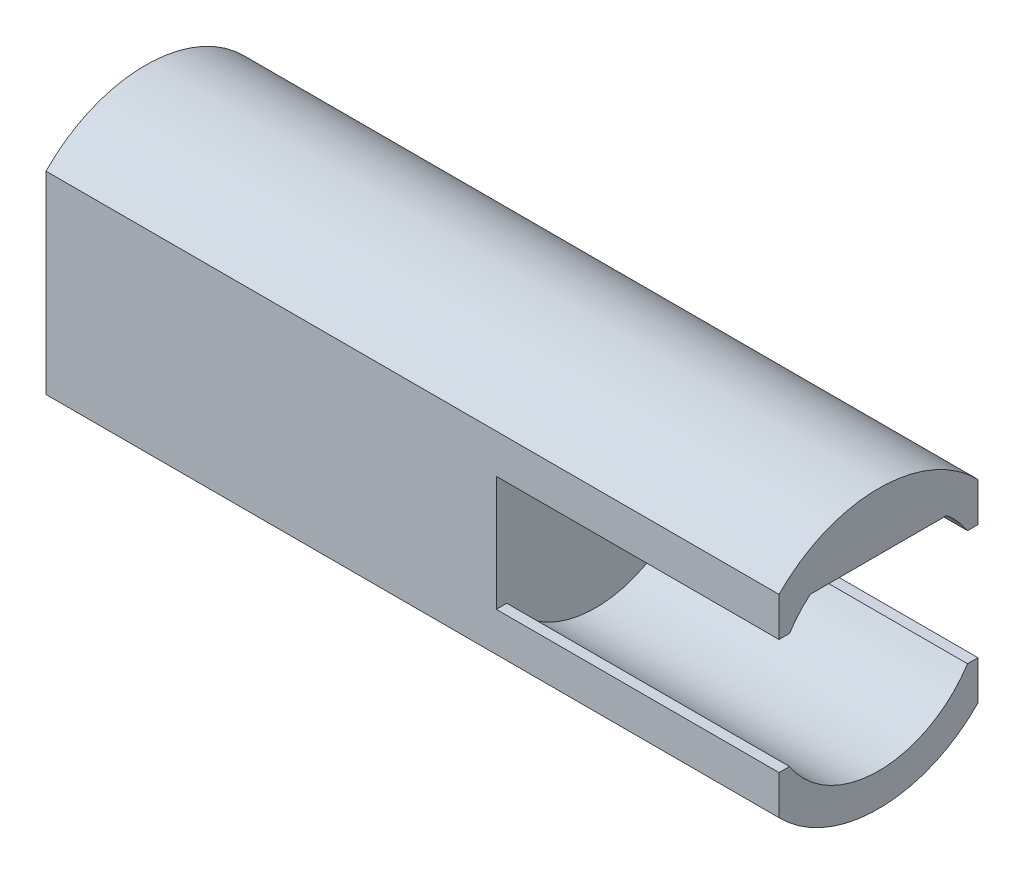
ISO-10303-21;
HEADER;
FILE_DESCRIPTION(('STEP AP214'),'2;1');
FILE_NAME('part.step','',(''),(''),'','','');
FILE_SCHEMA(('AUTOMOTIVE_DESIGN { 1 0 10303 214 1 1 1 1 }'));
ENDSEC;
DATA;
#1=APPLICATION_CONTEXT('core data for automotive mechanical design processes');
#2=APPLICATION_PROTOCOL_DEFINITION('international standard','automotive_design',2000,#1);
#3=PRODUCT_CONTEXT('',#1,'mechanical');
#4=PRODUCT('Part','Part','',(#3));
#5=PRODUCT_RELATED_PRODUCT_CATEGORY('part','',(#4));
#6=PRODUCT_DEFINITION_FORMATION('','',#4);
#7=PRODUCT_DEFINITION_CONTEXT('part definition',#1,'design');
#8=PRODUCT_DEFINITION('design','',#6,#7);
#9=PRODUCT_DEFINITION_SHAPE('','',#8);
#10=(LENGTH_UNIT() NAMED_UNIT(*) SI_UNIT(.MILLI.,.METRE.));
#11=(NAMED_UNIT(*) PLANE_ANGLE_UNIT() SI_UNIT($,.RADIAN.));
#12=(NAMED_UNIT(*) SI_UNIT($,.STERADIAN.) SOLID_ANGLE_UNIT());
#13=UNCERTAINTY_MEASURE_WITH_UNIT(LENGTH_MEASURE(1.E-05),#10,'distance_accuracy_value','');
#14=(GEOMETRIC_REPRESENTATION_CONTEXT(3) GLOBAL_UNCERTAINTY_ASSIGNED_CONTEXT((#13)) GLOBAL_UNIT_ASSIGNED_CONTEXT((#10,
#11,#12)) REPRESENTATION_CONTEXT('',''));
#15=CARTESIAN_POINT('',(0.,0.,0.));
#16=DIRECTION('',(0.,0.,1.));
#17=DIRECTION('',(1.,0.,0.));
#18=AXIS2_PLACEMENT_3D('',#15,#16,#17);
#19=CARTESIAN_POINT('',(0.,0.,0.));
#20=DIRECTION('',(-1.,0.,0.));
#21=DIRECTION('',(0.,0.,1.));
#22=AXIS2_PLACEMENT_3D('',#19,#20,#21);
#23=PLANE('',#22);
#24=DIRECTION('',(0.,0.,1.));
#25=VECTOR('',#24,1.);
#26=CARTESIAN_POINT('',(0.,-1.10028405423327,-1.7));
#27=LINE('',#26,#25);
#28=CARTESIAN_POINT('',(0.,-1.10028405423327,-1.9));
#29=VERTEX_POINT('',#28);
#30=CARTESIAN_POINT('',(0.,-1.10028405423328,-1.7));
#31=VERTEX_POINT('',#30);
#32=EDGE_CURVE('E168',#29,#31,#27,.T.);
#33=ORIENTED_EDGE('',*,*,#32,.F.);
#34=DIRECTION('',(0.,-1.,0.));
#35=VECTOR('',#34,1.);
#36=CARTESIAN_POINT('',(0.,1.84729532019112,-1.9));
#37=LINE('',#36,#35);
#38=CARTESIAN_POINT('',(0.,1.10028405423327,-1.9));
#39=VERTEX_POINT('',#38);
#40=EDGE_CURVE('E140',#39,#29,#37,.T.);
#41=ORIENTED_EDGE('',*,*,#40,.F.);
#42=DIRECTION('',(0.,0.,-1.));
#43=VECTOR('',#42,1.);
#44=CARTESIAN_POINT('',(0.,1.10028405423327,-1.7));
#45=LINE('',#44,#43);
#46=CARTESIAN_POINT('',(0.,1.10028405423327,-1.7));
#47=VERTEX_POINT('',#46);
#48=EDGE_CURVE('E197',#47,#39,#45,.T.);
#49=ORIENTED_EDGE('',*,*,#48,.F.);
#50=CARTESIAN_POINT('',(0.,0.,0.));
#51=DIRECTION('',(-1.,0.,0.));
#52=DIRECTION('',(0.,0.,-1.));
#53=AXIS2_PLACEMENT_3D('',#50,#51,#52);
#54=CIRCLE('',#53,2.025);
#55=CARTESIAN_POINT('',(0.,1.55,-1.30312125299221));
#56=VERTEX_POINT('',#55);
#57=EDGE_CURVE('E219',#56,#47,#54,.T.);
#58=ORIENTED_EDGE('',*,*,#57,.F.);
#59=DIRECTION('',(0.,0.,-1.));
#60=VECTOR('',#59,1.);
#61=CARTESIAN_POINT('',(0.,1.55,1.30312125299221));
#62=LINE('',#61,#60);
#63=CARTESIAN_POINT('',(0.,1.55,1.30312125299221));
#64=VERTEX_POINT('',#63);
#65=EDGE_CURVE('E216',#64,#56,#62,.T.);
#66=ORIENTED_EDGE('',*,*,#65,.F.);
#67=CARTESIAN_POINT('',(0.,0.,0.));
#68=DIRECTION('',(-1.,0.,0.));
#69=DIRECTION('',(0.,0.,-1.));
#70=AXIS2_PLACEMENT_3D('',#67,#68,#69);
#71=CIRCLE('',#70,2.025);
#72=CARTESIAN_POINT('',(0.,1.10028405423327,1.7));
#73=VERTEX_POINT('',#72);
#74=EDGE_CURVE('E213',#73,#64,#71,.T.);
#75=ORIENTED_EDGE('',*,*,#74,.F.);
#76=DIRECTION('',(0.,0.,-1.));
#77=VECTOR('',#76,1.);
#78=CARTESIAN_POINT('',(0.,1.10028405423327,1.9));
#79=LINE('',#78,#77);
#80=CARTESIAN_POINT('',(0.,1.10028405423327,1.9));
#81=VERTEX_POINT('',#80);
#82=EDGE_CURVE('E189',#81,#73,#79,.T.);
#83=ORIENTED_EDGE('',*,*,#82,.F.);
#84=DIRECTION('',(0.,1.,0.));
#85=VECTOR('',#84,1.);
#86=CARTESIAN_POINT('',(0.,-1.84729532019112,1.9));
#87=LINE('',#86,#85);
#88=CARTESIAN_POINT('',(0.,-1.10028405423327,1.9));
#89=VERTEX_POINT('',#88);
#90=EDGE_CURVE('E180',#89,#81,#87,.T.);
#91=ORIENTED_EDGE('',*,*,#90,.F.);
#92=DIRECTION('',(0.,0.,1.));
#93=VECTOR('',#92,1.);
#94=CARTESIAN_POINT('',(0.,-1.10028405423327,1.9));
#95=LINE('',#94,#93);
#96=CARTESIAN_POINT('',(0.,-1.10028405423327,1.7));
#97=VERTEX_POINT('',#96);
#98=EDGE_CURVE('E156',#97,#89,#95,.T.);
#99=ORIENTED_EDGE('',*,*,#98,.F.);
#100=CARTESIAN_POINT('',(0.,0.,0.));
#101=DIRECTION('',(-1.,0.,0.));
#102=DIRECTION('',(0.,0.,-1.));
#103=AXIS2_PLACEMENT_3D('',#100,#101,#102);
#104=CIRCLE('',#103,2.025);
#105=EDGE_CURVE('E158',#31,#97,#104,.T.);
#106=ORIENTED_EDGE('',*,*,#105,.F.);
#107=EDGE_LOOP('',(#33,#41,#49,#58,#66,#75,#83,#91,#99,#106));
#108=FACE_BOUND('',#107,.T.);
#109=ADVANCED_FACE('F33',(#108),#23,.F.);
#110=CARTESIAN_POINT('',(5.4,0.,0.));
#111=DIRECTION('',(-1.,0.,0.));
#112=DIRECTION('',(0.,0.,1.));
#113=AXIS2_PLACEMENT_3D('',#110,#111,#112);
#114=CYLINDRICAL_SURFACE('',#113,2.65);
#115=DIRECTION('',(-1.,0.,0.));
#116=VECTOR('',#115,1.);
#117=CARTESIAN_POINT('',(5.4,1.84729532019112,-1.9));
#118=LINE('',#117,#116);
#119=CARTESIAN_POINT('',(5.4,1.84729532019112,-1.9));
#120=VERTEX_POINT('',#119);
#121=CARTESIAN_POINT('',(-8.6,1.84729532019112,-1.9));
#122=VERTEX_POINT('',#121);
#123=EDGE_CURVE('E210',#120,#122,#118,.T.);
#124=ORIENTED_EDGE('',*,*,#123,.T.);
#125=CARTESIAN_POINT('',(-8.6,0.,0.));
#126=DIRECTION('',(1.,0.,0.));
#127=DIRECTION('',(0.,0.,-1.));
#128=AXIS2_PLACEMENT_3D('',#125,#126,#127);
#129=CIRCLE('',#128,2.65);
#130=CARTESIAN_POINT('',(-8.6,1.84729532019112,1.9));
#131=VERTEX_POINT('',#130);
#132=EDGE_CURVE('E181',#122,#131,#129,.T.);
#133=ORIENTED_EDGE('',*,*,#132,.T.);
#134=DIRECTION('',(-1.,0.,0.));
#135=VECTOR('',#134,1.);
#136=CARTESIAN_POINT('',(5.4,1.84729532019112,1.9));
#137=LINE('',#136,#135);
#138=CARTESIAN_POINT('',(5.4,1.84729532019112,1.9));
#139=VERTEX_POINT('',#138);
#140=EDGE_CURVE('E11',#139,#131,#137,.T.);
#141=ORIENTED_EDGE('',*,*,#140,.F.);
#142=CARTESIAN_POINT('',(5.4,0.,0.));
#143=DIRECTION('',(1.,0.,0.));
#144=DIRECTION('',(0.,0.,1.));
#145=AXIS2_PLACEMENT_3D('',#142,#143,#144);
#146=CIRCLE('',#145,2.65);
#147=EDGE_CURVE('E194',#120,#139,#146,.T.);
#148=ORIENTED_EDGE('',*,*,#147,.F.);
#149=EDGE_LOOP('',(#124,#133,#141,#148));
#150=FACE_BOUND('',#149,.T.);
#151=ADVANCED_FACE('F35',(#150),#114,.T.);
#152=CARTESIAN_POINT('',(5.4,1.84729532019112,1.9));
#153=DIRECTION('',(0.,0.,-1.));
#154=DIRECTION('',(-1.,0.,0.));
#155=AXIS2_PLACEMENT_3D('',#152,#153,#154);
#156=PLANE('',#155);
#157=ORIENTED_EDGE('',*,*,#140,.T.);
#158=DIRECTION('',(0.,-1.,0.));
#159=VECTOR('',#158,1.);
#160=CARTESIAN_POINT('',(-8.6,-1.84729532019112,1.9));
#161=LINE('',#160,#159);
#162=CARTESIAN_POINT('',(-8.6,-1.84729532019112,1.9));
#163=VERTEX_POINT('',#162);
#164=EDGE_CURVE('E184',#131,#163,#161,.T.);
#165=ORIENTED_EDGE('',*,*,#164,.T.);
#166=DIRECTION('',(1.,0.,0.));
#167=VECTOR('',#166,1.);
#168=CARTESIAN_POINT('',(-15.1215028942721,-1.84729532019112,1.9));
#169=LINE('',#168,#167);
#170=CARTESIAN_POINT('',(5.4,-1.84729532019112,1.9));
#171=VERTEX_POINT('',#170);
#172=EDGE_CURVE('E139',#163,#171,#169,.T.);
#173=ORIENTED_EDGE('',*,*,#172,.T.);
#174=DIRECTION('',(0.,-1.,0.));
#175=VECTOR('',#174,1.);
#176=CARTESIAN_POINT('',(5.4,-1.84729532019112,1.9));
#177=LINE('',#176,#175);
#178=CARTESIAN_POINT('',(5.4,-1.10028405423327,1.9));
#179=VERTEX_POINT('',#178);
#180=EDGE_CURVE('E155',#179,#171,#177,.T.);
#181=ORIENTED_EDGE('',*,*,#180,.F.);
#182=DIRECTION('',(-1.,0.,0.));
#183=VECTOR('',#182,1.);
#184=CARTESIAN_POINT('',(5.4,-1.10028405423327,1.9));
#185=LINE('',#184,#183);
#186=EDGE_CURVE('E167',#179,#89,#185,.T.);
#187=ORIENTED_EDGE('',*,*,#186,.T.);
#188=ORIENTED_EDGE('',*,*,#90,.T.);
#189=DIRECTION('',(-1.,0.,0.));
#190=VECTOR('',#189,1.);
#191=CARTESIAN_POINT('',(5.4,1.10028405423327,1.9));
#192=LINE('',#191,#190);
#193=CARTESIAN_POINT('',(5.4,1.10028405423327,1.9));
#194=VERTEX_POINT('',#193);
#195=EDGE_CURVE('E42',#194,#81,#192,.T.);
#196=ORIENTED_EDGE('',*,*,#195,.F.);
#197=DIRECTION('',(0.,-1.,0.));
#198=VECTOR('',#197,1.);
#199=CARTESIAN_POINT('',(5.4,1.84729532019112,1.9));
#200=LINE('',#199,#198);
#201=EDGE_CURVE('E196',#139,#194,#200,.T.);
#202=ORIENTED_EDGE('',*,*,#201,.F.);
#203=EDGE_LOOP('',(#157,#165,#173,#181,#187,#188,#196,#202));
#204=FACE_BOUND('',#203,.T.);
#205=ADVANCED_FACE('F246',(#204),#156,.F.);
#206=CARTESIAN_POINT('',(5.4,1.10028405423327,1.9));
#207=DIRECTION('',(0.,1.,0.));
#208=DIRECTION('',(0.,0.,1.));
#209=AXIS2_PLACEMENT_3D('',#206,#207,#208);
#210=PLANE('',#209);
#211=ORIENTED_EDGE('',*,*,#82,.T.);
#212=DIRECTION('',(-1.,0.,0.));
#213=VECTOR('',#212,1.);
#214=CARTESIAN_POINT('',(5.4,1.10028405423327,1.7));
#215=LINE('',#214,#213);
#216=CARTESIAN_POINT('',(5.4,1.10028405423327,1.7));
#217=VERTEX_POINT('',#216);
#218=EDGE_CURVE('E236',#217,#73,#215,.T.);
#219=ORIENTED_EDGE('',*,*,#218,.F.);
#220=DIRECTION('',(0.,0.,-1.));
#221=VECTOR('',#220,1.);
#222=CARTESIAN_POINT('',(5.4,1.10028405423327,1.9));
#223=LINE('',#222,#221);
#224=EDGE_CURVE('E199',#194,#217,#223,.T.);
#225=ORIENTED_EDGE('',*,*,#224,.F.);
#226=ORIENTED_EDGE('',*,*,#195,.T.);
#227=EDGE_LOOP('',(#211,#219,#225,#226));
#228=FACE_BOUND('',#227,.T.);
#229=ADVANCED_FACE('F242',(#228),#210,.F.);
#230=CARTESIAN_POINT('',(5.4,0.,0.));
#231=DIRECTION('',(-1.,0.,0.));
#232=DIRECTION('',(0.,0.,1.));
#233=AXIS2_PLACEMENT_3D('',#230,#231,#232);
#234=CYLINDRICAL_SURFACE('',#233,2.025);
#235=ORIENTED_EDGE('',*,*,#74,.T.);
#236=DIRECTION('',(-1.,0.,0.));
#237=VECTOR('',#236,1.);
#238=CARTESIAN_POINT('',(5.4,1.55,1.30312125299221));
#239=LINE('',#238,#237);
#240=CARTESIAN_POINT('',(5.4,1.55,1.30312125299221));
#241=VERTEX_POINT('',#240);
#242=EDGE_CURVE('E233',#241,#64,#239,.T.);
#243=ORIENTED_EDGE('',*,*,#242,.F.);
#244=CARTESIAN_POINT('',(5.4,0.,0.));
#245=DIRECTION('',(-1.,0.,0.));
#246=DIRECTION('',(0.,0.,-1.));
#247=AXIS2_PLACEMENT_3D('',#244,#245,#246);
#248=CIRCLE('',#247,2.025);
#249=EDGE_CURVE('E201',#217,#241,#248,.T.);
#250=ORIENTED_EDGE('',*,*,#249,.F.);
#251=ORIENTED_EDGE('',*,*,#218,.T.);
#252=EDGE_LOOP('',(#235,#243,#250,#251));
#253=FACE_BOUND('',#252,.T.);
#254=ADVANCED_FACE('F255',(#253),#234,.F.);
#255=CARTESIAN_POINT('',(5.4,1.55,1.30312125299221));
#256=DIRECTION('',(0.,1.,0.));
#257=DIRECTION('',(0.,0.,1.));
#258=AXIS2_PLACEMENT_3D('',#255,#256,#257);
#259=PLANE('',#258);
#260=ORIENTED_EDGE('',*,*,#65,.T.);
#261=DIRECTION('',(-1.,0.,0.));
#262=VECTOR('',#261,1.);
#263=CARTESIAN_POINT('',(5.4,1.55,-1.30312125299221));
#264=LINE('',#263,#262);
#265=CARTESIAN_POINT('',(5.4,1.55,-1.30312125299221));
#266=VERTEX_POINT('',#265);
#267=EDGE_CURVE('E230',#266,#56,#264,.T.);
#268=ORIENTED_EDGE('',*,*,#267,.F.);
#269=DIRECTION('',(0.,0.,-1.));
#270=VECTOR('',#269,1.);
#271=CARTESIAN_POINT('',(5.4,1.55,1.30312125299221));
#272=LINE('',#271,#270);
#273=EDGE_CURVE('E203',#241,#266,#272,.T.);
#274=ORIENTED_EDGE('',*,*,#273,.F.);
#275=ORIENTED_EDGE('',*,*,#242,.T.);
#276=EDGE_LOOP('',(#260,#268,#274,#275));
#277=FACE_BOUND('',#276,.T.);
#278=ADVANCED_FACE('F259',(#277),#259,.F.);
#279=CARTESIAN_POINT('',(5.4,0.,0.));
#280=DIRECTION('',(-1.,0.,0.));
#281=DIRECTION('',(0.,0.,1.));
#282=AXIS2_PLACEMENT_3D('',#279,#280,#281);
#283=CYLINDRICAL_SURFACE('',#282,2.025);
#284=ORIENTED_EDGE('',*,*,#57,.T.);
#285=DIRECTION('',(-1.,0.,0.));
#286=VECTOR('',#285,1.);
#287=CARTESIAN_POINT('',(5.4,1.10028405423327,-1.7));
#288=LINE('',#287,#286);
#289=CARTESIAN_POINT('',(5.4,1.10028405423327,-1.7));
#290=VERTEX_POINT('',#289);
#291=EDGE_CURVE('E227',#290,#47,#288,.T.);
#292=ORIENTED_EDGE('',*,*,#291,.F.);
#293=CARTESIAN_POINT('',(5.4,0.,0.));
#294=DIRECTION('',(-1.,0.,0.));
#295=DIRECTION('',(0.,0.,-1.));
#296=AXIS2_PLACEMENT_3D('',#293,#294,#295);
#297=CIRCLE('',#296,2.025);
#298=EDGE_CURVE('E205',#266,#290,#297,.T.);
#299=ORIENTED_EDGE('',*,*,#298,.F.);
#300=ORIENTED_EDGE('',*,*,#267,.T.);
#301=EDGE_LOOP('',(#284,#292,#299,#300));
#302=FACE_BOUND('',#301,.T.);
#303=ADVANCED_FACE('F276',(#302),#283,.F.);
#304=CARTESIAN_POINT('',(5.4,1.10028405423327,-1.7));
#305=DIRECTION('',(0.,1.,0.));
#306=DIRECTION('',(0.,0.,1.));
#307=AXIS2_PLACEMENT_3D('',#304,#305,#306);
#308=PLANE('',#307);
#309=ORIENTED_EDGE('',*,*,#48,.T.);
#310=DIRECTION('',(-1.,0.,0.));
#311=VECTOR('',#310,1.);
#312=CARTESIAN_POINT('',(5.4,1.10028405423327,-1.9));
#313=LINE('',#312,#311);
#314=CARTESIAN_POINT('',(5.4,1.10028405423327,-1.9));
#315=VERTEX_POINT('',#314);
#316=EDGE_CURVE('E225',#315,#39,#313,.T.);
#317=ORIENTED_EDGE('',*,*,#316,.F.);
#318=DIRECTION('',(0.,0.,-1.));
#319=VECTOR('',#318,1.);
#320=CARTESIAN_POINT('',(5.4,1.10028405423327,-1.7));
#321=LINE('',#320,#319);
#322=EDGE_CURVE('E207',#290,#315,#321,.T.);
#323=ORIENTED_EDGE('',*,*,#322,.F.);
#324=ORIENTED_EDGE('',*,*,#291,.T.);
#325=EDGE_LOOP('',(#309,#317,#323,#324));
#326=FACE_BOUND('',#325,.T.);
#327=ADVANCED_FACE('F274',(#326),#308,.F.);
#328=CARTESIAN_POINT('',(5.4,1.84729532019112,-1.9));
#329=DIRECTION('',(0.,0.,1.));
#330=DIRECTION('',(1.,0.,0.));
#331=AXIS2_PLACEMENT_3D('',#328,#329,#330);
#332=PLANE('',#331);
#333=ORIENTED_EDGE('',*,*,#316,.T.);
#334=ORIENTED_EDGE('',*,*,#40,.T.);
#335=DIRECTION('',(-1.,0.,0.));
#336=VECTOR('',#335,1.);
#337=CARTESIAN_POINT('',(5.4,-1.10028405423327,-1.9));
#338=LINE('',#337,#336);
#339=CARTESIAN_POINT('',(5.4,-1.10028405423327,-1.9));
#340=VERTEX_POINT('',#339);
#341=EDGE_CURVE('E147',#340,#29,#338,.T.);
#342=ORIENTED_EDGE('',*,*,#341,.F.);
#343=DIRECTION('',(0.,1.,0.));
#344=VECTOR('',#343,1.);
#345=CARTESIAN_POINT('',(5.4,-1.84729532019112,-1.9));
#346=LINE('',#345,#344);
#347=CARTESIAN_POINT('',(5.4,-1.84729532019112,-1.9));
#348=VERTEX_POINT('',#347);
#349=EDGE_CURVE('E143',#348,#340,#346,.T.);
#350=ORIENTED_EDGE('',*,*,#349,.F.);
#351=DIRECTION('',(1.,0.,0.));
#352=VECTOR('',#351,1.);
#353=CARTESIAN_POINT('',(-15.1215028942721,-1.84729532019112,-1.9));
#354=LINE('',#353,#352);
#355=CARTESIAN_POINT('',(-8.6,-1.84729532019112,-1.9));
#356=VERTEX_POINT('',#355);
#357=EDGE_CURVE('E130',#356,#348,#354,.T.);
#358=ORIENTED_EDGE('',*,*,#357,.F.);
#359=DIRECTION('',(0.,1.,0.));
#360=VECTOR('',#359,1.);
#361=CARTESIAN_POINT('',(-8.6,1.84729532019112,-1.9));
#362=LINE('',#361,#360);
#363=EDGE_CURVE('E185',#356,#122,#362,.T.);
#364=ORIENTED_EDGE('',*,*,#363,.T.);
#365=ORIENTED_EDGE('',*,*,#123,.F.);
#366=DIRECTION('',(0.,1.,0.));
#367=VECTOR('',#366,1.);
#368=CARTESIAN_POINT('',(5.4,1.84729532019112,-1.9));
#369=LINE('',#368,#367);
#370=EDGE_CURVE('E49',#315,#120,#369,.T.);
#371=ORIENTED_EDGE('',*,*,#370,.F.);
#372=EDGE_LOOP('',(#333,#334,#342,#350,#358,#364,#365,#371));
#373=FACE_BOUND('',#372,.T.);
#374=ADVANCED_FACE('F145',(#373),#332,.F.);
#375=CARTESIAN_POINT('',(5.4,0.,0.));
#376=DIRECTION('',(-1.,0.,0.));
#377=DIRECTION('',(0.,0.,1.));
#378=AXIS2_PLACEMENT_3D('',#375,#376,#377);
#379=PLANE('',#378);
#380=ORIENTED_EDGE('',*,*,#147,.T.);
#381=ORIENTED_EDGE('',*,*,#201,.T.);
#382=ORIENTED_EDGE('',*,*,#224,.T.);
#383=ORIENTED_EDGE('',*,*,#249,.T.);
#384=ORIENTED_EDGE('',*,*,#273,.T.);
#385=ORIENTED_EDGE('',*,*,#298,.T.);
#386=ORIENTED_EDGE('',*,*,#322,.T.);
#387=ORIENTED_EDGE('',*,*,#370,.T.);
#388=EDGE_LOOP('',(#380,#381,#382,#383,#384,#385,#386,#387));
#389=FACE_BOUND('',#388,.T.);
#390=ADVANCED_FACE('F262',(#389),#379,.F.);
#391=CARTESIAN_POINT('',(-15.1215028942721,0.,0.));
#392=DIRECTION('',(1.,0.,0.));
#393=DIRECTION('',(0.,0.,-1.));
#394=AXIS2_PLACEMENT_3D('',#391,#392,#393);
#395=CYLINDRICAL_SURFACE('',#394,2.65);
#396=ORIENTED_EDGE('',*,*,#172,.F.);
#397=CARTESIAN_POINT('',(-8.6,0.,0.));
#398=DIRECTION('',(1.,0.,0.));
#399=DIRECTION('',(0.,0.,-1.));
#400=AXIS2_PLACEMENT_3D('',#397,#398,#399);
#401=CIRCLE('',#400,2.65);
#402=EDGE_CURVE('E136',#163,#356,#401,.T.);
#403=ORIENTED_EDGE('',*,*,#402,.T.);
#404=ORIENTED_EDGE('',*,*,#357,.T.);
#405=CARTESIAN_POINT('',(5.4,0.,0.));
#406=DIRECTION('',(1.,0.,0.));
#407=DIRECTION('',(0.,0.,-1.));
#408=AXIS2_PLACEMENT_3D('',#405,#406,#407);
#409=CIRCLE('',#408,2.65);
#410=EDGE_CURVE('E135',#171,#348,#409,.T.);
#411=ORIENTED_EDGE('',*,*,#410,.F.);
#412=EDGE_LOOP('',(#396,#403,#404,#411));
#413=FACE_BOUND('',#412,.T.);
#414=ADVANCED_FACE('F133',(#413),#395,.T.);
#415=CARTESIAN_POINT('',(-8.6,0.,0.));
#416=DIRECTION('',(1.,0.,0.));
#417=DIRECTION('',(0.,0.,-1.));
#418=AXIS2_PLACEMENT_3D('',#415,#416,#417);
#419=PLANE('',#418);
#420=ORIENTED_EDGE('',*,*,#164,.F.);
#421=ORIENTED_EDGE('',*,*,#132,.F.);
#422=ORIENTED_EDGE('',*,*,#363,.F.);
#423=ORIENTED_EDGE('',*,*,#402,.F.);
#424=EDGE_LOOP('',(#420,#421,#422,#423));
#425=FACE_BOUND('',#424,.T.);
#426=ADVANCED_FACE('F270',(#425),#419,.F.);
#427=CARTESIAN_POINT('',(5.4,-1.10028405423327,-1.7));
#428=DIRECTION('',(0.,-1.,0.));
#429=DIRECTION('',(0.,0.,-1.));
#430=AXIS2_PLACEMENT_3D('',#427,#428,#429);
#431=PLANE('',#430);
#432=ORIENTED_EDGE('',*,*,#32,.T.);
#433=DIRECTION('',(-1.,0.,0.));
#434=VECTOR('',#433,1.);
#435=CARTESIAN_POINT('',(5.4,-1.10028405423328,-1.7));
#436=LINE('',#435,#434);
#437=CARTESIAN_POINT('',(5.4,-1.10028405423328,-1.7));
#438=VERTEX_POINT('',#437);
#439=EDGE_CURVE('E176',#438,#31,#436,.T.);
#440=ORIENTED_EDGE('',*,*,#439,.F.);
#441=DIRECTION('',(0.,0.,1.));
#442=VECTOR('',#441,1.);
#443=CARTESIAN_POINT('',(5.4,-1.10028405423327,-1.7));
#444=LINE('',#443,#442);
#445=EDGE_CURVE('E150',#340,#438,#444,.T.);
#446=ORIENTED_EDGE('',*,*,#445,.F.);
#447=ORIENTED_EDGE('',*,*,#341,.T.);
#448=EDGE_LOOP('',(#432,#440,#446,#447));
#449=FACE_BOUND('',#448,.T.);
#450=ADVANCED_FACE('F316',(#449),#431,.F.);
#451=CARTESIAN_POINT('',(5.4,0.,0.));
#452=DIRECTION('',(-1.,0.,0.));
#453=DIRECTION('',(0.,0.,1.));
#454=AXIS2_PLACEMENT_3D('',#451,#452,#453);
#455=CYLINDRICAL_SURFACE('',#454,2.025);
#456=ORIENTED_EDGE('',*,*,#105,.T.);
#457=DIRECTION('',(-1.,0.,0.));
#458=VECTOR('',#457,1.);
#459=CARTESIAN_POINT('',(5.4,-1.10028405423327,1.7));
#460=LINE('',#459,#458);
#461=CARTESIAN_POINT('',(5.4,-1.10028405423327,1.7));
#462=VERTEX_POINT('',#461);
#463=EDGE_CURVE('E173',#462,#97,#460,.T.);
#464=ORIENTED_EDGE('',*,*,#463,.F.);
#465=CARTESIAN_POINT('',(5.4,0.,0.));
#466=DIRECTION('',(-1.,0.,0.));
#467=DIRECTION('',(0.,0.,-1.));
#468=AXIS2_PLACEMENT_3D('',#465,#466,#467);
#469=CIRCLE('',#468,2.025);
#470=EDGE_CURVE('E162',#438,#462,#469,.T.);
#471=ORIENTED_EDGE('',*,*,#470,.F.);
#472=ORIENTED_EDGE('',*,*,#439,.T.);
#473=EDGE_LOOP('',(#456,#464,#471,#472));
#474=FACE_BOUND('',#473,.T.);
#475=ADVANCED_FACE('F322',(#474),#455,.F.);
#476=CARTESIAN_POINT('',(5.4,-1.10028405423327,1.9));
#477=DIRECTION('',(0.,-1.,0.));
#478=DIRECTION('',(0.,0.,-1.));
#479=AXIS2_PLACEMENT_3D('',#476,#477,#478);
#480=PLANE('',#479);
#481=ORIENTED_EDGE('',*,*,#98,.T.);
#482=ORIENTED_EDGE('',*,*,#186,.F.);
#483=DIRECTION('',(0.,0.,1.));
#484=VECTOR('',#483,1.);
#485=CARTESIAN_POINT('',(5.4,-1.10028405423327,1.9));
#486=LINE('',#485,#484);
#487=EDGE_CURVE('E164',#462,#179,#486,.T.);
#488=ORIENTED_EDGE('',*,*,#487,.F.);
#489=ORIENTED_EDGE('',*,*,#463,.T.);
#490=EDGE_LOOP('',(#481,#482,#488,#489));
#491=FACE_BOUND('',#490,.T.);
#492=ADVANCED_FACE('F329',(#491),#480,.F.);
#493=CARTESIAN_POINT('',(5.4,0.,0.));
#494=DIRECTION('',(1.,0.,0.));
#495=DIRECTION('',(0.,0.,-1.));
#496=AXIS2_PLACEMENT_3D('',#493,#494,#495);
#497=PLANE('',#496);
#498=ORIENTED_EDGE('',*,*,#410,.T.);
#499=ORIENTED_EDGE('',*,*,#349,.T.);
#500=ORIENTED_EDGE('',*,*,#445,.T.);
#501=ORIENTED_EDGE('',*,*,#470,.T.);
#502=ORIENTED_EDGE('',*,*,#487,.T.);
#503=ORIENTED_EDGE('',*,*,#180,.T.);
#504=EDGE_LOOP('',(#498,#499,#500,#501,#502,#503));
#505=FACE_BOUND('',#504,.T.);
#506=ADVANCED_FACE('F153',(#505),#497,.T.);
#507=CLOSED_SHELL('',(#109,#151,#205,#229,#254,#278,#303,#327,#374,#390,#414,#426,#450,#475,
#492,#506));
#508=MANIFOLD_SOLID_BREP('B2',#507);
#509=ADVANCED_BREP_SHAPE_REPRESENTATION('',(#18,#508),#14);
#510=SHAPE_DEFINITION_REPRESENTATION(#9,#509);
ENDSEC;
END-ISO-10303-21;
